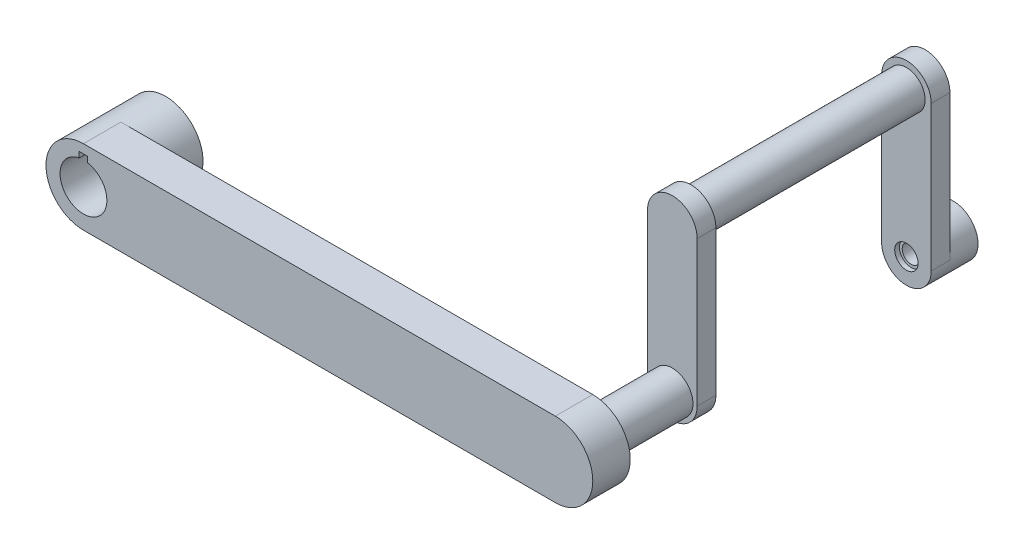
ISO-10303-21;
HEADER;
FILE_DESCRIPTION(('STEP AP214'),'2;1');
FILE_NAME('part.step','',(''),(''),'','','');
FILE_SCHEMA(('AUTOMOTIVE_DESIGN { 1 0 10303 214 1 1 1 1 }'));
ENDSEC;
DATA;
#1=APPLICATION_CONTEXT('core data for automotive mechanical design processes');
#2=APPLICATION_PROTOCOL_DEFINITION('international standard','automotive_design',2000,#1);
#3=PRODUCT_CONTEXT('',#1,'mechanical');
#4=PRODUCT('Part','Part','',(#3));
#5=PRODUCT_RELATED_PRODUCT_CATEGORY('part','',(#4));
#6=PRODUCT_DEFINITION_FORMATION('','',#4);
#7=PRODUCT_DEFINITION_CONTEXT('part definition',#1,'design');
#8=PRODUCT_DEFINITION('design','',#6,#7);
#9=PRODUCT_DEFINITION_SHAPE('','',#8);
#10=(LENGTH_UNIT() NAMED_UNIT(*) SI_UNIT(.MILLI.,.METRE.));
#11=(NAMED_UNIT(*) PLANE_ANGLE_UNIT() SI_UNIT($,.RADIAN.));
#12=(NAMED_UNIT(*) SI_UNIT($,.STERADIAN.) SOLID_ANGLE_UNIT());
#13=UNCERTAINTY_MEASURE_WITH_UNIT(LENGTH_MEASURE(1.E-05),#10,'distance_accuracy_value','');
#14=(GEOMETRIC_REPRESENTATION_CONTEXT(3) GLOBAL_UNCERTAINTY_ASSIGNED_CONTEXT((#13)) GLOBAL_UNIT_ASSIGNED_CONTEXT((#10,
#11,#12)) REPRESENTATION_CONTEXT('',''));
#15=CARTESIAN_POINT('',(0.,0.,0.));
#16=DIRECTION('',(0.,0.,1.));
#17=DIRECTION('',(1.,0.,0.));
#18=AXIS2_PLACEMENT_3D('',#15,#16,#17);
#19=CARTESIAN_POINT('',(50.4,0.,-35.5));
#20=DIRECTION('',(0.,0.,1.));
#21=DIRECTION('',(1.,0.,0.));
#22=AXIS2_PLACEMENT_3D('',#19,#20,#21);
#23=CYLINDRICAL_SURFACE('',#22,0.950000000000001);
#24=CARTESIAN_POINT('',(50.4,0.,-38.5));
#25=DIRECTION('',(0.,0.,-1.));
#26=DIRECTION('',(-1.,0.,0.));
#27=AXIS2_PLACEMENT_3D('',#24,#25,#26);
#28=CIRCLE('',#27,0.950000000000001);
#29=CARTESIAN_POINT('',(49.45,0.,-38.5));
#30=VERTEX_POINT('',#29);
#31=EDGE_CURVE('E192',#30,#30,#28,.T.);
#32=ORIENTED_EDGE('',*,*,#31,.T.);
#33=EDGE_LOOP('',(#32));
#34=FACE_BOUND('',#33,.T.);
#35=CARTESIAN_POINT('',(50.4,0.,-34.));
#36=DIRECTION('',(0.,0.,1.));
#37=DIRECTION('',(1.,0.,0.));
#38=AXIS2_PLACEMENT_3D('',#35,#36,#37);
#39=CIRCLE('',#38,0.950000000000001);
#40=CARTESIAN_POINT('',(51.35,0.,-34.));
#41=VERTEX_POINT('',#40);
#42=EDGE_CURVE('E45',#41,#41,#39,.T.);
#43=ORIENTED_EDGE('',*,*,#42,.T.);
#44=EDGE_LOOP('',(#43));
#45=FACE_BOUND('',#44,.T.);
#46=ADVANCED_FACE('F41',(#34,#45),#23,.F.);
#47=CARTESIAN_POINT('',(0.,0.,0.));
#48=DIRECTION('',(0.,0.,1.));
#49=DIRECTION('',(1.,0.,0.));
#50=AXIS2_PLACEMENT_3D('',#47,#48,#49);
#51=PLANE('',#50);
#52=CARTESIAN_POINT('',(50.4,0.,0.));
#53=DIRECTION('',(0.,0.,1.));
#54=DIRECTION('',(1.,0.,0.));
#55=AXIS2_PLACEMENT_3D('',#52,#53,#54);
#56=CIRCLE('',#55,2.2);
#57=CARTESIAN_POINT('',(52.6,0.,0.));
#58=VERTEX_POINT('',#57);
#59=EDGE_CURVE('E11',#58,#58,#56,.F.);
#60=ORIENTED_EDGE('',*,*,#59,.F.);
#61=EDGE_LOOP('',(#60));
#62=FACE_BOUND('',#61,.T.);
#63=CARTESIAN_POINT('',(0.,0.,0.));
#64=DIRECTION('',(0.,0.,-1.));
#65=DIRECTION('',(-1.,0.,0.));
#66=AXIS2_PLACEMENT_3D('',#63,#64,#65);
#67=CIRCLE('',#66,4.);
#68=CARTESIAN_POINT('',(0.,4.,0.));
#69=VERTEX_POINT('',#68);
#70=CARTESIAN_POINT('',(0.,-4.,0.));
#71=VERTEX_POINT('',#70);
#72=EDGE_CURVE('E265',#69,#71,#67,.T.);
#73=ORIENTED_EDGE('',*,*,#72,.F.);
#74=DIRECTION('',(-1.,0.,0.));
#75=VECTOR('',#74,1.);
#76=CARTESIAN_POINT('',(0.,4.,0.));
#77=LINE('',#76,#75);
#78=CARTESIAN_POINT('',(50.4,4.,0.));
#79=VERTEX_POINT('',#78);
#80=EDGE_CURVE('E288',#79,#69,#77,.T.);
#81=ORIENTED_EDGE('',*,*,#80,.F.);
#82=CARTESIAN_POINT('',(50.4,0.,0.));
#83=DIRECTION('',(0.,0.,1.));
#84=DIRECTION('',(1.,0.,0.));
#85=AXIS2_PLACEMENT_3D('',#82,#83,#84);
#86=CIRCLE('',#85,4.);
#87=CARTESIAN_POINT('',(50.4,-4.,0.));
#88=VERTEX_POINT('',#87);
#89=EDGE_CURVE('E85',#88,#79,#86,.T.);
#90=ORIENTED_EDGE('',*,*,#89,.F.);
#91=DIRECTION('',(1.,0.,0.));
#92=VECTOR('',#91,1.);
#93=CARTESIAN_POINT('',(0.,-4.,0.));
#94=LINE('',#93,#92);
#95=EDGE_CURVE('E285',#71,#88,#94,.T.);
#96=ORIENTED_EDGE('',*,*,#95,.F.);
#97=EDGE_LOOP('',(#73,#81,#90,#96));
#98=FACE_BOUND('',#97,.T.);
#99=ADVANCED_FACE('F312',(#62,#98),#51,.F.);
#100=CARTESIAN_POINT('',(0.,0.,4.));
#101=DIRECTION('',(0.,0.,1.));
#102=DIRECTION('',(1.,0.,0.));
#103=AXIS2_PLACEMENT_3D('',#100,#101,#102);
#104=PLANE('',#103);
#105=CARTESIAN_POINT('',(0.,0.,4.));
#106=DIRECTION('',(0.,0.,1.));
#107=DIRECTION('',(1.,0.,0.));
#108=AXIS2_PLACEMENT_3D('',#105,#106,#107);
#109=CIRCLE('',#108,4.);
#110=CARTESIAN_POINT('',(0.,4.,4.));
#111=VERTEX_POINT('',#110);
#112=CARTESIAN_POINT('',(0.,-4.,4.));
#113=VERTEX_POINT('',#112);
#114=EDGE_CURVE('E286',#111,#113,#109,.T.);
#115=ORIENTED_EDGE('',*,*,#114,.T.);
#116=DIRECTION('',(1.,0.,0.));
#117=VECTOR('',#116,1.);
#118=CARTESIAN_POINT('',(0.,-4.,4.));
#119=LINE('',#118,#117);
#120=CARTESIAN_POINT('',(50.4,-4.,4.));
#121=VERTEX_POINT('',#120);
#122=EDGE_CURVE('E93',#113,#121,#119,.T.);
#123=ORIENTED_EDGE('',*,*,#122,.T.);
#124=CARTESIAN_POINT('',(50.4,0.,4.));
#125=DIRECTION('',(0.,0.,1.));
#126=DIRECTION('',(1.,0.,0.));
#127=AXIS2_PLACEMENT_3D('',#124,#125,#126);
#128=CIRCLE('',#127,4.);
#129=CARTESIAN_POINT('',(50.4,4.,4.));
#130=VERTEX_POINT('',#129);
#131=EDGE_CURVE('E290',#121,#130,#128,.T.);
#132=ORIENTED_EDGE('',*,*,#131,.T.);
#133=DIRECTION('',(-1.,0.,0.));
#134=VECTOR('',#133,1.);
#135=CARTESIAN_POINT('',(0.,4.,4.));
#136=LINE('',#135,#134);
#137=EDGE_CURVE('E66',#130,#111,#136,.T.);
#138=ORIENTED_EDGE('',*,*,#137,.T.);
#139=EDGE_LOOP('',(#115,#123,#132,#138));
#140=FACE_BOUND('',#139,.T.);
#141=DIRECTION('',(0.,1.,0.));
#142=VECTOR('',#141,1.);
#143=CARTESIAN_POINT('',(0.45,2.45916652547159,4.));
#144=LINE('',#143,#142);
#145=CARTESIAN_POINT('',(0.45,2.45916652547159,4.));
#146=VERTEX_POINT('',#145);
#147=CARTESIAN_POINT('',(0.45,3.05916652547159,4.));
#148=VERTEX_POINT('',#147);
#149=EDGE_CURVE('E272',#146,#148,#144,.T.);
#150=ORIENTED_EDGE('',*,*,#149,.F.);
#151=CARTESIAN_POINT('',(0.,0.,4.));
#152=DIRECTION('',(0.,0.,1.));
#153=DIRECTION('',(1.,0.,0.));
#154=AXIS2_PLACEMENT_3D('',#151,#152,#153);
#155=CIRCLE('',#154,2.5);
#156=CARTESIAN_POINT('',(-0.45,2.45916652547159,4.));
#157=VERTEX_POINT('',#156);
#158=EDGE_CURVE('E269',#157,#146,#155,.T.);
#159=ORIENTED_EDGE('',*,*,#158,.F.);
#160=DIRECTION('',(0.,-1.,0.));
#161=VECTOR('',#160,1.);
#162=CARTESIAN_POINT('',(-0.45,2.45916652547159,4.));
#163=LINE('',#162,#161);
#164=CARTESIAN_POINT('',(-0.45,3.05916652547159,4.));
#165=VERTEX_POINT('',#164);
#166=EDGE_CURVE('E276',#165,#157,#163,.T.);
#167=ORIENTED_EDGE('',*,*,#166,.F.);
#168=DIRECTION('',(-1.,0.,0.));
#169=VECTOR('',#168,1.);
#170=CARTESIAN_POINT('',(-0.45,3.05916652547159,4.));
#171=LINE('',#170,#169);
#172=EDGE_CURVE('E274',#148,#165,#171,.T.);
#173=ORIENTED_EDGE('',*,*,#172,.F.);
#174=EDGE_LOOP('',(#150,#159,#167,#173));
#175=FACE_BOUND('',#174,.T.);
#176=ADVANCED_FACE('F317',(#140,#175),#104,.T.);
#177=CARTESIAN_POINT('',(0.,0.,4.));
#178=DIRECTION('',(0.,0.,-1.));
#179=DIRECTION('',(-1.,0.,0.));
#180=AXIS2_PLACEMENT_3D('',#177,#178,#179);
#181=CYLINDRICAL_SURFACE('',#180,4.);
#182=DIRECTION('',(0.,0.,-1.));
#183=VECTOR('',#182,1.);
#184=CARTESIAN_POINT('',(0.,4.,4.));
#185=LINE('',#184,#183);
#186=EDGE_CURVE('E293',#111,#69,#185,.T.);
#187=ORIENTED_EDGE('',*,*,#186,.T.);
#188=ORIENTED_EDGE('',*,*,#72,.T.);
#189=DIRECTION('',(0.,0.,-1.));
#190=VECTOR('',#189,1.);
#191=CARTESIAN_POINT('',(0.,-4.,4.));
#192=LINE('',#191,#190);
#193=EDGE_CURVE('E50',#113,#71,#192,.T.);
#194=ORIENTED_EDGE('',*,*,#193,.F.);
#195=ORIENTED_EDGE('',*,*,#114,.F.);
#196=EDGE_LOOP('',(#187,#188,#194,#195));
#197=FACE_BOUND('',#196,.T.);
#198=CARTESIAN_POINT('',(0.,0.,-4.77));
#199=DIRECTION('',(0.,0.,-1.));
#200=DIRECTION('',(-1.,0.,0.));
#201=AXIS2_PLACEMENT_3D('',#198,#199,#200);
#202=CIRCLE('',#201,4.);
#203=CARTESIAN_POINT('',(-4.,0.,-4.77));
#204=VERTEX_POINT('',#203);
#205=EDGE_CURVE('E266',#204,#204,#202,.T.);
#206=ORIENTED_EDGE('',*,*,#205,.F.);
#207=EDGE_LOOP('',(#206));
#208=FACE_BOUND('',#207,.T.);
#209=ADVANCED_FACE('F43',(#197,#208),#181,.T.);
#210=CARTESIAN_POINT('',(0.,-4.,4.));
#211=DIRECTION('',(0.,1.,0.));
#212=DIRECTION('',(0.,0.,1.));
#213=AXIS2_PLACEMENT_3D('',#210,#211,#212);
#214=PLANE('',#213);
#215=ORIENTED_EDGE('',*,*,#95,.T.);
#216=DIRECTION('',(0.,0.,-1.));
#217=VECTOR('',#216,1.);
#218=CARTESIAN_POINT('',(50.4,-4.,4.));
#219=LINE('',#218,#217);
#220=EDGE_CURVE('E302',#121,#88,#219,.T.);
#221=ORIENTED_EDGE('',*,*,#220,.F.);
#222=ORIENTED_EDGE('',*,*,#122,.F.);
#223=ORIENTED_EDGE('',*,*,#193,.T.);
#224=EDGE_LOOP('',(#215,#221,#222,#223));
#225=FACE_BOUND('',#224,.T.);
#226=ADVANCED_FACE('F305',(#225),#214,.F.);
#227=CARTESIAN_POINT('',(50.4,0.,4.));
#228=DIRECTION('',(0.,0.,-1.));
#229=DIRECTION('',(-1.,0.,0.));
#230=AXIS2_PLACEMENT_3D('',#227,#228,#229);
#231=CYLINDRICAL_SURFACE('',#230,4.);
#232=ORIENTED_EDGE('',*,*,#89,.T.);
#233=DIRECTION('',(0.,0.,-1.));
#234=VECTOR('',#233,1.);
#235=CARTESIAN_POINT('',(50.4,4.,4.));
#236=LINE('',#235,#234);
#237=EDGE_CURVE('E300',#130,#79,#236,.T.);
#238=ORIENTED_EDGE('',*,*,#237,.F.);
#239=ORIENTED_EDGE('',*,*,#131,.F.);
#240=ORIENTED_EDGE('',*,*,#220,.T.);
#241=EDGE_LOOP('',(#232,#238,#239,#240));
#242=FACE_BOUND('',#241,.T.);
#243=ADVANCED_FACE('F316',(#242),#231,.T.);
#244=CARTESIAN_POINT('',(0.,4.,4.));
#245=DIRECTION('',(0.,-1.,0.));
#246=DIRECTION('',(0.,0.,-1.));
#247=AXIS2_PLACEMENT_3D('',#244,#245,#246);
#248=PLANE('',#247);
#249=ORIENTED_EDGE('',*,*,#80,.T.);
#250=ORIENTED_EDGE('',*,*,#186,.F.);
#251=ORIENTED_EDGE('',*,*,#137,.F.);
#252=ORIENTED_EDGE('',*,*,#237,.T.);
#253=EDGE_LOOP('',(#249,#250,#251,#252));
#254=FACE_BOUND('',#253,.T.);
#255=ADVANCED_FACE('F314',(#254),#248,.F.);
#256=CARTESIAN_POINT('',(0.,0.,4.));
#257=DIRECTION('',(0.,0.,-1.));
#258=DIRECTION('',(-1.,0.,0.));
#259=AXIS2_PLACEMENT_3D('',#256,#257,#258);
#260=CYLINDRICAL_SURFACE('',#259,2.5);
#261=DIRECTION('',(0.,0.,-1.));
#262=VECTOR('',#261,1.);
#263=CARTESIAN_POINT('',(0.45,2.45916652547159,4.));
#264=LINE('',#263,#262);
#265=CARTESIAN_POINT('',(0.45,2.45916652547159,-4.77));
#266=VERTEX_POINT('',#265);
#267=EDGE_CURVE('E283',#146,#266,#264,.T.);
#268=ORIENTED_EDGE('',*,*,#267,.T.);
#269=CARTESIAN_POINT('',(0.,0.,-4.77));
#270=DIRECTION('',(0.,0.,-1.));
#271=DIRECTION('',(-1.,0.,0.));
#272=AXIS2_PLACEMENT_3D('',#269,#270,#271);
#273=CIRCLE('',#272,2.5);
#274=CARTESIAN_POINT('',(-0.45,2.45916652547159,-4.77));
#275=VERTEX_POINT('',#274);
#276=EDGE_CURVE('E254',#266,#275,#273,.T.);
#277=ORIENTED_EDGE('',*,*,#276,.T.);
#278=DIRECTION('',(0.,0.,-1.));
#279=VECTOR('',#278,1.);
#280=CARTESIAN_POINT('',(-0.45,2.45916652547159,4.));
#281=LINE('',#280,#279);
#282=EDGE_CURVE('E278',#157,#275,#281,.T.);
#283=ORIENTED_EDGE('',*,*,#282,.F.);
#284=ORIENTED_EDGE('',*,*,#158,.T.);
#285=EDGE_LOOP('',(#268,#277,#283,#284));
#286=FACE_BOUND('',#285,.T.);
#287=ADVANCED_FACE('F339',(#286),#260,.F.);
#288=CARTESIAN_POINT('',(0.45,2.45916652547159,4.));
#289=DIRECTION('',(-1.,0.,0.));
#290=DIRECTION('',(0.,0.,1.));
#291=AXIS2_PLACEMENT_3D('',#288,#289,#290);
#292=PLANE('',#291);
#293=DIRECTION('',(0.,0.,-1.));
#294=VECTOR('',#293,1.);
#295=CARTESIAN_POINT('',(0.45,3.05916652547159,4.));
#296=LINE('',#295,#294);
#297=CARTESIAN_POINT('',(0.45,3.05916652547159,-4.77));
#298=VERTEX_POINT('',#297);
#299=EDGE_CURVE('E281',#148,#298,#296,.T.);
#300=ORIENTED_EDGE('',*,*,#299,.T.);
#301=DIRECTION('',(0.,-1.,0.));
#302=VECTOR('',#301,1.);
#303=CARTESIAN_POINT('',(0.45,2.45916652547159,-4.77));
#304=LINE('',#303,#302);
#305=EDGE_CURVE('E262',#298,#266,#304,.T.);
#306=ORIENTED_EDGE('',*,*,#305,.T.);
#307=ORIENTED_EDGE('',*,*,#267,.F.);
#308=ORIENTED_EDGE('',*,*,#149,.T.);
#309=EDGE_LOOP('',(#300,#306,#307,#308));
#310=FACE_BOUND('',#309,.T.);
#311=ADVANCED_FACE('F328',(#310),#292,.T.);
#312=CARTESIAN_POINT('',(-0.45,3.05916652547159,4.));
#313=DIRECTION('',(0.,-1.,0.));
#314=DIRECTION('',(0.,0.,-1.));
#315=AXIS2_PLACEMENT_3D('',#312,#313,#314);
#316=PLANE('',#315);
#317=DIRECTION('',(0.,0.,-1.));
#318=VECTOR('',#317,1.);
#319=CARTESIAN_POINT('',(-0.45,3.05916652547159,4.));
#320=LINE('',#319,#318);
#321=CARTESIAN_POINT('',(-0.45,3.05916652547159,-4.77));
#322=VERTEX_POINT('',#321);
#323=EDGE_CURVE('E57',#165,#322,#320,.T.);
#324=ORIENTED_EDGE('',*,*,#323,.T.);
#325=DIRECTION('',(1.,0.,0.));
#326=VECTOR('',#325,1.);
#327=CARTESIAN_POINT('',(0.45,3.05916652547159,-4.77));
#328=LINE('',#327,#326);
#329=EDGE_CURVE('E259',#322,#298,#328,.T.);
#330=ORIENTED_EDGE('',*,*,#329,.T.);
#331=ORIENTED_EDGE('',*,*,#299,.F.);
#332=ORIENTED_EDGE('',*,*,#172,.T.);
#333=EDGE_LOOP('',(#324,#330,#331,#332));
#334=FACE_BOUND('',#333,.T.);
#335=ADVANCED_FACE('F330',(#334),#316,.T.);
#336=CARTESIAN_POINT('',(-0.45,2.45916652547159,4.));
#337=DIRECTION('',(1.,0.,0.));
#338=DIRECTION('',(0.,0.,-1.));
#339=AXIS2_PLACEMENT_3D('',#336,#337,#338);
#340=PLANE('',#339);
#341=ORIENTED_EDGE('',*,*,#282,.T.);
#342=DIRECTION('',(0.,1.,0.));
#343=VECTOR('',#342,1.);
#344=CARTESIAN_POINT('',(-0.45,3.05916652547159,-4.77));
#345=LINE('',#344,#343);
#346=EDGE_CURVE('E257',#275,#322,#345,.T.);
#347=ORIENTED_EDGE('',*,*,#346,.T.);
#348=ORIENTED_EDGE('',*,*,#323,.F.);
#349=ORIENTED_EDGE('',*,*,#166,.T.);
#350=EDGE_LOOP('',(#341,#347,#348,#349));
#351=FACE_BOUND('',#350,.T.);
#352=ADVANCED_FACE('F340',(#351),#340,.T.);
#353=CARTESIAN_POINT('',(0.,0.,-4.77));
#354=DIRECTION('',(0.,0.,-1.));
#355=DIRECTION('',(-1.,0.,0.));
#356=AXIS2_PLACEMENT_3D('',#353,#354,#355);
#357=PLANE('',#356);
#358=ORIENTED_EDGE('',*,*,#205,.T.);
#359=EDGE_LOOP('',(#358));
#360=FACE_BOUND('',#359,.T.);
#361=ORIENTED_EDGE('',*,*,#346,.F.);
#362=ORIENTED_EDGE('',*,*,#276,.F.);
#363=ORIENTED_EDGE('',*,*,#305,.F.);
#364=ORIENTED_EDGE('',*,*,#329,.F.);
#365=EDGE_LOOP('',(#361,#362,#363,#364));
#366=FACE_BOUND('',#365,.T.);
#367=ADVANCED_FACE('F336',(#360,#366),#357,.T.);
#368=CARTESIAN_POINT('',(50.4,0.,-8.5));
#369=DIRECTION('',(0.,0.,1.));
#370=DIRECTION('',(1.,0.,0.));
#371=AXIS2_PLACEMENT_3D('',#368,#369,#370);
#372=CYLINDRICAL_SURFACE('',#371,2.2);
#373=CARTESIAN_POINT('',(50.4,0.,-8.5));
#374=DIRECTION('',(0.,0.,-1.));
#375=DIRECTION('',(-1.,0.,0.));
#376=AXIS2_PLACEMENT_3D('',#373,#374,#375);
#377=CIRCLE('',#376,2.2);
#378=CARTESIAN_POINT('',(48.2,0.,-8.5));
#379=VERTEX_POINT('',#378);
#380=EDGE_CURVE('E251',#379,#379,#377,.T.);
#381=ORIENTED_EDGE('',*,*,#380,.F.);
#382=EDGE_LOOP('',(#381));
#383=FACE_BOUND('',#382,.T.);
#384=ORIENTED_EDGE('',*,*,#59,.T.);
#385=EDGE_LOOP('',(#384));
#386=FACE_BOUND('',#385,.T.);
#387=ADVANCED_FACE('F347',(#383,#386),#372,.T.);
#388=CARTESIAN_POINT('',(50.4,15.5,-10.5));
#389=DIRECTION('',(0.,0.,1.));
#390=DIRECTION('',(1.,0.,0.));
#391=AXIS2_PLACEMENT_3D('',#388,#389,#390);
#392=CYLINDRICAL_SURFACE('',#391,2.65);
#393=CARTESIAN_POINT('',(50.4,15.5,-8.5));
#394=DIRECTION('',(0.,0.,-1.));
#395=DIRECTION('',(-1.,0.,0.));
#396=AXIS2_PLACEMENT_3D('',#393,#394,#395);
#397=CIRCLE('',#396,2.65);
#398=CARTESIAN_POINT('',(47.75,15.5,-8.5));
#399=VERTEX_POINT('',#398);
#400=CARTESIAN_POINT('',(53.05,15.5,-8.5));
#401=VERTEX_POINT('',#400);
#402=EDGE_CURVE('E219',#399,#401,#397,.T.);
#403=ORIENTED_EDGE('',*,*,#402,.T.);
#404=DIRECTION('',(0.,0.,1.));
#405=VECTOR('',#404,1.);
#406=CARTESIAN_POINT('',(53.05,15.5,-10.5));
#407=LINE('',#406,#405);
#408=CARTESIAN_POINT('',(53.05,15.5,-10.5));
#409=VERTEX_POINT('',#408);
#410=EDGE_CURVE('E248',#409,#401,#407,.T.);
#411=ORIENTED_EDGE('',*,*,#410,.F.);
#412=CARTESIAN_POINT('',(50.4,15.5,-10.5));
#413=DIRECTION('',(0.,0.,-1.));
#414=DIRECTION('',(-1.,0.,0.));
#415=AXIS2_PLACEMENT_3D('',#412,#413,#414);
#416=CIRCLE('',#415,2.65);
#417=CARTESIAN_POINT('',(47.75,15.5,-10.5));
#418=VERTEX_POINT('',#417);
#419=EDGE_CURVE('E222',#418,#409,#416,.T.);
#420=ORIENTED_EDGE('',*,*,#419,.F.);
#421=DIRECTION('',(0.,0.,1.));
#422=VECTOR('',#421,1.);
#423=CARTESIAN_POINT('',(47.75,15.5,-10.5));
#424=LINE('',#423,#422);
#425=EDGE_CURVE('E232',#418,#399,#424,.T.);
#426=ORIENTED_EDGE('',*,*,#425,.T.);
#427=EDGE_LOOP('',(#403,#411,#420,#426));
#428=FACE_BOUND('',#427,.T.);
#429=ADVANCED_FACE('F406',(#428),#392,.T.);
#430=CARTESIAN_POINT('',(53.05,15.5,-10.5));
#431=DIRECTION('',(-1.,0.,0.));
#432=DIRECTION('',(0.,0.,1.));
#433=AXIS2_PLACEMENT_3D('',#430,#431,#432);
#434=PLANE('',#433);
#435=DIRECTION('',(0.,-1.,0.));
#436=VECTOR('',#435,1.);
#437=CARTESIAN_POINT('',(53.05,15.5,-8.5));
#438=LINE('',#437,#436);
#439=CARTESIAN_POINT('',(53.05,0.,-8.5));
#440=VERTEX_POINT('',#439);
#441=EDGE_CURVE('E235',#401,#440,#438,.T.);
#442=ORIENTED_EDGE('',*,*,#441,.T.);
#443=DIRECTION('',(0.,0.,1.));
#444=VECTOR('',#443,1.);
#445=CARTESIAN_POINT('',(53.05,0.,-10.5));
#446=LINE('',#445,#444);
#447=CARTESIAN_POINT('',(53.05,0.,-10.5));
#448=VERTEX_POINT('',#447);
#449=EDGE_CURVE('E245',#448,#440,#446,.T.);
#450=ORIENTED_EDGE('',*,*,#449,.F.);
#451=DIRECTION('',(0.,-1.,0.));
#452=VECTOR('',#451,1.);
#453=CARTESIAN_POINT('',(53.05,15.5,-10.5));
#454=LINE('',#453,#452);
#455=EDGE_CURVE('E225',#409,#448,#454,.T.);
#456=ORIENTED_EDGE('',*,*,#455,.F.);
#457=ORIENTED_EDGE('',*,*,#410,.T.);
#458=EDGE_LOOP('',(#442,#450,#456,#457));
#459=FACE_BOUND('',#458,.T.);
#460=ADVANCED_FACE('F402',(#459),#434,.F.);
#461=CARTESIAN_POINT('',(50.4,0.,-10.5));
#462=DIRECTION('',(0.,0.,1.));
#463=DIRECTION('',(1.,0.,0.));
#464=AXIS2_PLACEMENT_3D('',#461,#462,#463);
#465=CYLINDRICAL_SURFACE('',#464,2.65);
#466=CARTESIAN_POINT('',(50.4,0.,-8.5));
#467=DIRECTION('',(0.,0.,-1.));
#468=DIRECTION('',(-1.,0.,0.));
#469=AXIS2_PLACEMENT_3D('',#466,#467,#468);
#470=CIRCLE('',#469,2.65);
#471=CARTESIAN_POINT('',(47.75,0.,-8.5));
#472=VERTEX_POINT('',#471);
#473=EDGE_CURVE('E237',#440,#472,#470,.T.);
#474=ORIENTED_EDGE('',*,*,#473,.T.);
#475=DIRECTION('',(0.,0.,1.));
#476=VECTOR('',#475,1.);
#477=CARTESIAN_POINT('',(47.75,0.,-10.5));
#478=LINE('',#477,#476);
#479=CARTESIAN_POINT('',(47.75,0.,-10.5));
#480=VERTEX_POINT('',#479);
#481=EDGE_CURVE('E242',#480,#472,#478,.T.);
#482=ORIENTED_EDGE('',*,*,#481,.F.);
#483=CARTESIAN_POINT('',(50.4,0.,-10.5));
#484=DIRECTION('',(0.,0.,-1.));
#485=DIRECTION('',(-1.,0.,0.));
#486=AXIS2_PLACEMENT_3D('',#483,#484,#485);
#487=CIRCLE('',#486,2.65);
#488=EDGE_CURVE('E228',#448,#480,#487,.T.);
#489=ORIENTED_EDGE('',*,*,#488,.F.);
#490=ORIENTED_EDGE('',*,*,#449,.T.);
#491=EDGE_LOOP('',(#474,#482,#489,#490));
#492=FACE_BOUND('',#491,.T.);
#493=ADVANCED_FACE('F398',(#492),#465,.T.);
#494=CARTESIAN_POINT('',(47.75,15.5,-10.5));
#495=DIRECTION('',(1.,0.,0.));
#496=DIRECTION('',(0.,0.,-1.));
#497=AXIS2_PLACEMENT_3D('',#494,#495,#496);
#498=PLANE('',#497);
#499=DIRECTION('',(0.,1.,0.));
#500=VECTOR('',#499,1.);
#501=CARTESIAN_POINT('',(47.75,15.5,-8.5));
#502=LINE('',#501,#500);
#503=EDGE_CURVE('E226',#472,#399,#502,.T.);
#504=ORIENTED_EDGE('',*,*,#503,.T.);
#505=ORIENTED_EDGE('',*,*,#425,.F.);
#506=DIRECTION('',(0.,1.,0.));
#507=VECTOR('',#506,1.);
#508=CARTESIAN_POINT('',(47.75,15.5,-10.5));
#509=LINE('',#508,#507);
#510=EDGE_CURVE('E230',#480,#418,#509,.T.);
#511=ORIENTED_EDGE('',*,*,#510,.F.);
#512=ORIENTED_EDGE('',*,*,#481,.T.);
#513=EDGE_LOOP('',(#504,#505,#511,#512));
#514=FACE_BOUND('',#513,.T.);
#515=ADVANCED_FACE('F391',(#514),#498,.F.);
#516=CARTESIAN_POINT('',(50.4,15.5,-10.5));
#517=DIRECTION('',(0.,0.,-1.));
#518=DIRECTION('',(-1.,0.,0.));
#519=AXIS2_PLACEMENT_3D('',#516,#517,#518);
#520=PLANE('',#519);
#521=CARTESIAN_POINT('',(50.4,15.5,-10.5));
#522=DIRECTION('',(0.,0.,-1.));
#523=DIRECTION('',(-1.,0.,0.));
#524=AXIS2_PLACEMENT_3D('',#521,#522,#523);
#525=CIRCLE('',#524,2.);
#526=CARTESIAN_POINT('',(48.4,15.5,-10.5));
#527=VERTEX_POINT('',#526);
#528=EDGE_CURVE('E215',#527,#527,#525,.T.);
#529=ORIENTED_EDGE('',*,*,#528,.F.);
#530=EDGE_LOOP('',(#529));
#531=FACE_BOUND('',#530,.T.);
#532=ORIENTED_EDGE('',*,*,#419,.T.);
#533=ORIENTED_EDGE('',*,*,#455,.T.);
#534=ORIENTED_EDGE('',*,*,#488,.T.);
#535=ORIENTED_EDGE('',*,*,#510,.T.);
#536=EDGE_LOOP('',(#532,#533,#534,#535));
#537=FACE_BOUND('',#536,.T.);
#538=ADVANCED_FACE('F388',(#531,#537),#520,.T.);
#539=CARTESIAN_POINT('',(50.4,15.5,-8.5));
#540=DIRECTION('',(0.,0.,-1.));
#541=DIRECTION('',(-1.,0.,0.));
#542=AXIS2_PLACEMENT_3D('',#539,#540,#541);
#543=PLANE('',#542);
#544=ORIENTED_EDGE('',*,*,#380,.T.);
#545=EDGE_LOOP('',(#544));
#546=FACE_BOUND('',#545,.T.);
#547=ORIENTED_EDGE('',*,*,#402,.F.);
#548=ORIENTED_EDGE('',*,*,#503,.F.);
#549=ORIENTED_EDGE('',*,*,#473,.F.);
#550=ORIENTED_EDGE('',*,*,#441,.F.);
#551=EDGE_LOOP('',(#547,#548,#549,#550));
#552=FACE_BOUND('',#551,.T.);
#553=ADVANCED_FACE('F386',(#546,#552),#543,.F.);
#554=CARTESIAN_POINT('',(50.4,15.5,-33.5));
#555=DIRECTION('',(0.,0.,1.));
#556=DIRECTION('',(1.,0.,0.));
#557=AXIS2_PLACEMENT_3D('',#554,#555,#556);
#558=CYLINDRICAL_SURFACE('',#557,2.);
#559=CARTESIAN_POINT('',(50.4,15.5,-33.5));
#560=DIRECTION('',(0.,0.,-1.));
#561=DIRECTION('',(-1.,0.,0.));
#562=AXIS2_PLACEMENT_3D('',#559,#560,#561);
#563=CIRCLE('',#562,2.);
#564=CARTESIAN_POINT('',(48.4,15.5,-33.5));
#565=VERTEX_POINT('',#564);
#566=EDGE_CURVE('E216',#565,#565,#563,.T.);
#567=ORIENTED_EDGE('',*,*,#566,.F.);
#568=EDGE_LOOP('',(#567));
#569=FACE_BOUND('',#568,.T.);
#570=ORIENTED_EDGE('',*,*,#528,.T.);
#571=EDGE_LOOP('',(#570));
#572=FACE_BOUND('',#571,.T.);
#573=ADVANCED_FACE('F369',(#569,#572),#558,.T.);
#574=CARTESIAN_POINT('',(50.4,15.5,-35.5));
#575=DIRECTION('',(0.,0.,-1.));
#576=DIRECTION('',(-1.,0.,0.));
#577=AXIS2_PLACEMENT_3D('',#574,#575,#576);
#578=PLANE('',#577);
#579=CARTESIAN_POINT('',(50.4,0.,-35.5));
#580=DIRECTION('',(0.,0.,-1.));
#581=DIRECTION('',(-1.,0.,0.));
#582=AXIS2_PLACEMENT_3D('',#579,#580,#581);
#583=CIRCLE('',#582,2.65);
#584=CARTESIAN_POINT('',(47.75,0.,-35.5));
#585=VERTEX_POINT('',#584);
#586=CARTESIAN_POINT('',(53.05,0.,-35.5));
#587=VERTEX_POINT('',#586);
#588=EDGE_CURVE('E184',#585,#587,#583,.T.);
#589=ORIENTED_EDGE('',*,*,#588,.F.);
#590=DIRECTION('',(0.,1.,0.));
#591=VECTOR('',#590,1.);
#592=CARTESIAN_POINT('',(47.75,15.5,-35.5));
#593=LINE('',#592,#591);
#594=CARTESIAN_POINT('',(47.75,15.5,-35.5));
#595=VERTEX_POINT('',#594);
#596=EDGE_CURVE('E166',#585,#595,#593,.T.);
#597=ORIENTED_EDGE('',*,*,#596,.T.);
#598=CARTESIAN_POINT('',(50.4,15.5,-35.5));
#599=DIRECTION('',(0.,0.,-1.));
#600=DIRECTION('',(-1.,0.,0.));
#601=AXIS2_PLACEMENT_3D('',#598,#599,#600);
#602=CIRCLE('',#601,2.65);
#603=CARTESIAN_POINT('',(53.05,15.5,-35.5));
#604=VERTEX_POINT('',#603);
#605=EDGE_CURVE('E200',#595,#604,#602,.T.);
#606=ORIENTED_EDGE('',*,*,#605,.T.);
#607=DIRECTION('',(0.,-1.,0.));
#608=VECTOR('',#607,1.);
#609=CARTESIAN_POINT('',(53.05,15.5,-35.5));
#610=LINE('',#609,#608);
#611=EDGE_CURVE('E177',#604,#587,#610,.T.);
#612=ORIENTED_EDGE('',*,*,#611,.T.);
#613=EDGE_LOOP('',(#589,#597,#606,#612));
#614=FACE_BOUND('',#613,.T.);
#615=ADVANCED_FACE('F189',(#614),#578,.T.);
#616=CARTESIAN_POINT('',(50.4,15.5,-33.5));
#617=DIRECTION('',(0.,0.,-1.));
#618=DIRECTION('',(-1.,0.,0.));
#619=AXIS2_PLACEMENT_3D('',#616,#617,#618);
#620=PLANE('',#619);
#621=CARTESIAN_POINT('',(50.4,0.,-33.5));
#622=DIRECTION('',(0.,0.,1.));
#623=DIRECTION('',(1.,0.,0.));
#624=AXIS2_PLACEMENT_3D('',#621,#622,#623);
#625=CIRCLE('',#624,1.25);
#626=CARTESIAN_POINT('',(51.65,0.,-33.5));
#627=VERTEX_POINT('',#626);
#628=EDGE_CURVE('E536',#627,#627,#625,.T.);
#629=ORIENTED_EDGE('',*,*,#628,.F.);
#630=EDGE_LOOP('',(#629));
#631=FACE_BOUND('',#630,.T.);
#632=ORIENTED_EDGE('',*,*,#566,.T.);
#633=EDGE_LOOP('',(#632));
#634=FACE_BOUND('',#633,.T.);
#635=CARTESIAN_POINT('',(50.4,15.5,-33.5));
#636=DIRECTION('',(0.,0.,-1.));
#637=DIRECTION('',(-1.,0.,0.));
#638=AXIS2_PLACEMENT_3D('',#635,#636,#637);
#639=CIRCLE('',#638,2.65);
#640=CARTESIAN_POINT('',(47.75,15.5,-33.5));
#641=VERTEX_POINT('',#640);
#642=CARTESIAN_POINT('',(53.05,15.5,-33.5));
#643=VERTEX_POINT('',#642);
#644=EDGE_CURVE('E195',#641,#643,#639,.T.);
#645=ORIENTED_EDGE('',*,*,#644,.F.);
#646=DIRECTION('',(0.,1.,0.));
#647=VECTOR('',#646,1.);
#648=CARTESIAN_POINT('',(47.75,15.5,-33.5));
#649=LINE('',#648,#647);
#650=CARTESIAN_POINT('',(47.75,0.,-33.5));
#651=VERTEX_POINT('',#650);
#652=EDGE_CURVE('E202',#651,#641,#649,.T.);
#653=ORIENTED_EDGE('',*,*,#652,.F.);
#654=CARTESIAN_POINT('',(50.4,0.,-33.5));
#655=DIRECTION('',(0.,0.,-1.));
#656=DIRECTION('',(-1.,0.,0.));
#657=AXIS2_PLACEMENT_3D('',#654,#655,#656);
#658=CIRCLE('',#657,2.65);
#659=CARTESIAN_POINT('',(53.05,0.,-33.5));
#660=VERTEX_POINT('',#659);
#661=EDGE_CURVE('E186',#660,#651,#658,.T.);
#662=ORIENTED_EDGE('',*,*,#661,.F.);
#663=DIRECTION('',(0.,-1.,0.));
#664=VECTOR('',#663,1.);
#665=CARTESIAN_POINT('',(53.05,15.5,-33.5));
#666=LINE('',#665,#664);
#667=EDGE_CURVE('E206',#643,#660,#666,.T.);
#668=ORIENTED_EDGE('',*,*,#667,.F.);
#669=EDGE_LOOP('',(#645,#653,#662,#668));
#670=FACE_BOUND('',#669,.T.);
#671=ADVANCED_FACE('F368',(#631,#634,#670),#620,.F.);
#672=CARTESIAN_POINT('',(50.4,15.5,-35.5));
#673=DIRECTION('',(0.,0.,1.));
#674=DIRECTION('',(1.,0.,0.));
#675=AXIS2_PLACEMENT_3D('',#672,#673,#674);
#676=CYLINDRICAL_SURFACE('',#675,2.65);
#677=ORIENTED_EDGE('',*,*,#644,.T.);
#678=DIRECTION('',(0.,0.,1.));
#679=VECTOR('',#678,1.);
#680=CARTESIAN_POINT('',(53.05,15.5,-35.5));
#681=LINE('',#680,#679);
#682=EDGE_CURVE('E212',#604,#643,#681,.T.);
#683=ORIENTED_EDGE('',*,*,#682,.F.);
#684=ORIENTED_EDGE('',*,*,#605,.F.);
#685=DIRECTION('',(0.,0.,1.));
#686=VECTOR('',#685,1.);
#687=CARTESIAN_POINT('',(47.75,15.5,-35.5));
#688=LINE('',#687,#686);
#689=EDGE_CURVE('E172',#595,#641,#688,.T.);
#690=ORIENTED_EDGE('',*,*,#689,.T.);
#691=EDGE_LOOP('',(#677,#683,#684,#690));
#692=FACE_BOUND('',#691,.T.);
#693=ADVANCED_FACE('F371',(#692),#676,.T.);
#694=CARTESIAN_POINT('',(53.05,15.5,-35.5));
#695=DIRECTION('',(-1.,0.,0.));
#696=DIRECTION('',(0.,0.,1.));
#697=AXIS2_PLACEMENT_3D('',#694,#695,#696);
#698=PLANE('',#697);
#699=ORIENTED_EDGE('',*,*,#667,.T.);
#700=DIRECTION('',(0.,0.,1.));
#701=VECTOR('',#700,1.);
#702=CARTESIAN_POINT('',(53.05,0.,-35.5));
#703=LINE('',#702,#701);
#704=EDGE_CURVE('E187',#587,#660,#703,.T.);
#705=ORIENTED_EDGE('',*,*,#704,.F.);
#706=ORIENTED_EDGE('',*,*,#611,.F.);
#707=ORIENTED_EDGE('',*,*,#682,.T.);
#708=EDGE_LOOP('',(#699,#705,#706,#707));
#709=FACE_BOUND('',#708,.T.);
#710=ADVANCED_FACE('F377',(#709),#698,.F.);
#711=CARTESIAN_POINT('',(50.4,0.,-35.5));
#712=DIRECTION('',(0.,0.,1.));
#713=DIRECTION('',(1.,0.,0.));
#714=AXIS2_PLACEMENT_3D('',#711,#712,#713);
#715=CYLINDRICAL_SURFACE('',#714,2.65);
#716=ORIENTED_EDGE('',*,*,#661,.T.);
#717=DIRECTION('',(0.,0.,1.));
#718=VECTOR('',#717,1.);
#719=CARTESIAN_POINT('',(47.75,0.,-35.5));
#720=LINE('',#719,#718);
#721=EDGE_CURVE('E169',#585,#651,#720,.T.);
#722=ORIENTED_EDGE('',*,*,#721,.F.);
#723=ORIENTED_EDGE('',*,*,#588,.T.);
#724=ORIENTED_EDGE('',*,*,#704,.T.);
#725=EDGE_LOOP('',(#716,#722,#723,#724));
#726=FACE_BOUND('',#725,.T.);
#727=CARTESIAN_POINT('',(50.4,0.,-38.5));
#728=DIRECTION('',(0.,0.,-1.));
#729=DIRECTION('',(-1.,0.,0.));
#730=AXIS2_PLACEMENT_3D('',#727,#728,#729);
#731=CIRCLE('',#730,2.65);
#732=CARTESIAN_POINT('',(47.75,0.,-38.5));
#733=VERTEX_POINT('',#732);
#734=EDGE_CURVE('E191',#733,#733,#731,.T.);
#735=ORIENTED_EDGE('',*,*,#734,.F.);
#736=EDGE_LOOP('',(#735));
#737=FACE_BOUND('',#736,.T.);
#738=ADVANCED_FACE('F181',(#726,#737),#715,.T.);
#739=CARTESIAN_POINT('',(47.75,15.5,-35.5));
#740=DIRECTION('',(1.,0.,0.));
#741=DIRECTION('',(0.,0.,-1.));
#742=AXIS2_PLACEMENT_3D('',#739,#740,#741);
#743=PLANE('',#742);
#744=ORIENTED_EDGE('',*,*,#652,.T.);
#745=ORIENTED_EDGE('',*,*,#689,.F.);
#746=ORIENTED_EDGE('',*,*,#596,.F.);
#747=ORIENTED_EDGE('',*,*,#721,.T.);
#748=EDGE_LOOP('',(#744,#745,#746,#747));
#749=FACE_BOUND('',#748,.T.);
#750=ADVANCED_FACE('F168',(#749),#743,.F.);
#751=CARTESIAN_POINT('',(50.4,0.,-38.5));
#752=DIRECTION('',(0.,0.,-1.));
#753=DIRECTION('',(-1.,0.,0.));
#754=AXIS2_PLACEMENT_3D('',#751,#752,#753);
#755=PLANE('',#754);
#756=ORIENTED_EDGE('',*,*,#734,.T.);
#757=EDGE_LOOP('',(#756));
#758=FACE_BOUND('',#757,.T.);
#759=ORIENTED_EDGE('',*,*,#31,.F.);
#760=EDGE_LOOP('',(#759));
#761=FACE_BOUND('',#760,.T.);
#762=ADVANCED_FACE('F364',(#758,#761),#755,.T.);
#763=CARTESIAN_POINT('',(50.4,0.,-34.));
#764=DIRECTION('',(0.,0.,1.));
#765=DIRECTION('',(1.,0.,0.));
#766=AXIS2_PLACEMENT_3D('',#763,#764,#765);
#767=CYLINDRICAL_SURFACE('',#766,1.25);
#768=CARTESIAN_POINT('',(50.4,0.,-34.));
#769=DIRECTION('',(0.,0.,1.));
#770=DIRECTION('',(1.,0.,0.));
#771=AXIS2_PLACEMENT_3D('',#768,#769,#770);
#772=CIRCLE('',#771,1.25);
#773=CARTESIAN_POINT('',(51.65,0.,-34.));
#774=VERTEX_POINT('',#773);
#775=EDGE_CURVE('E535',#774,#774,#772,.T.);
#776=ORIENTED_EDGE('',*,*,#775,.F.);
#777=EDGE_LOOP('',(#776));
#778=FACE_BOUND('',#777,.T.);
#779=ORIENTED_EDGE('',*,*,#628,.T.);
#780=EDGE_LOOP('',(#779));
#781=FACE_BOUND('',#780,.T.);
#782=ADVANCED_FACE('F499',(#778,#781),#767,.F.);
#783=CARTESIAN_POINT('',(50.4,0.,-34.));
#784=DIRECTION('',(0.,0.,1.));
#785=DIRECTION('',(1.,0.,0.));
#786=AXIS2_PLACEMENT_3D('',#783,#784,#785);
#787=PLANE('',#786);
#788=ORIENTED_EDGE('',*,*,#42,.F.);
#789=EDGE_LOOP('',(#788));
#790=FACE_BOUND('',#789,.T.);
#791=ORIENTED_EDGE('',*,*,#775,.T.);
#792=EDGE_LOOP('',(#791));
#793=FACE_BOUND('',#792,.T.);
#794=ADVANCED_FACE('F518',(#790,#793),#787,.T.);
#795=CLOSED_SHELL('',(#46,#99,#176,#209,#226,#243,#255,#287,#311,#335,#352,#367,#387,#429,#460,
#493,#515,#538,#553,#573,#615,#671,#693,#710,#738,#750,#762,#782,#794));
#796=MANIFOLD_SOLID_BREP('B2',#795);
#797=ADVANCED_BREP_SHAPE_REPRESENTATION('',(#18,#796),#14);
#798=SHAPE_DEFINITION_REPRESENTATION(#9,#797);
ENDSEC;
END-ISO-10303-21;
